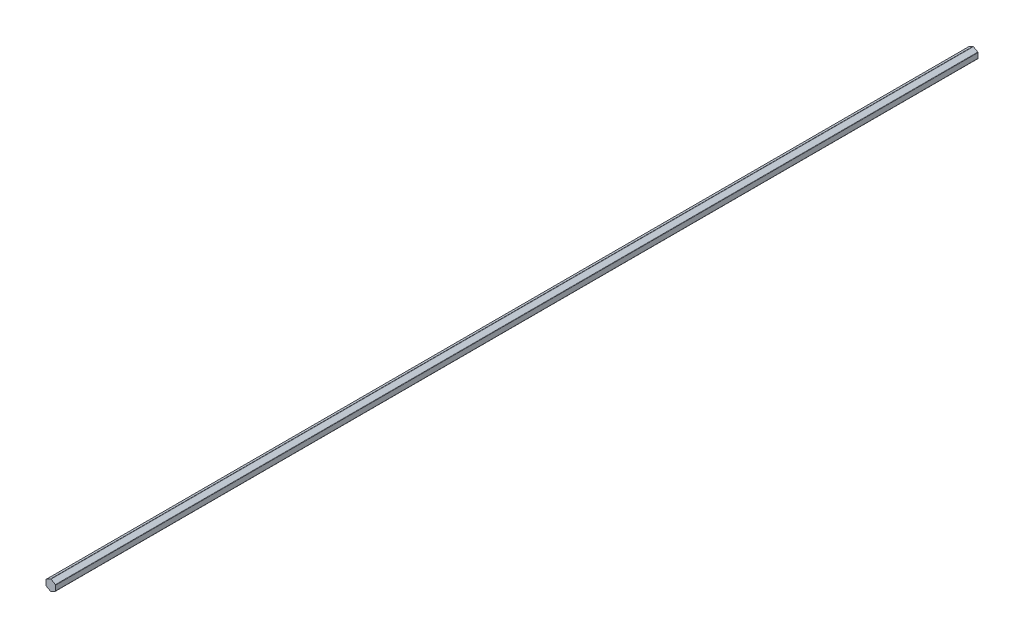
ISO-10303-21;
HEADER;
FILE_DESCRIPTION(('STEP AP214'),'2;1');
FILE_NAME('part.step','',(''),(''),'','','');
FILE_SCHEMA(('AUTOMOTIVE_DESIGN { 1 0 10303 214 1 1 1 1 }'));
ENDSEC;
DATA;
#1=APPLICATION_CONTEXT('core data for automotive mechanical design processes');
#2=APPLICATION_PROTOCOL_DEFINITION('international standard','automotive_design',2000,#1);
#3=PRODUCT_CONTEXT('',#1,'mechanical');
#4=PRODUCT('Part','Part','',(#3));
#5=PRODUCT_RELATED_PRODUCT_CATEGORY('part','',(#4));
#6=PRODUCT_DEFINITION_FORMATION('','',#4);
#7=PRODUCT_DEFINITION_CONTEXT('part definition',#1,'design');
#8=PRODUCT_DEFINITION('design','',#6,#7);
#9=PRODUCT_DEFINITION_SHAPE('','',#8);
#10=(LENGTH_UNIT() NAMED_UNIT(*) SI_UNIT(.MILLI.,.METRE.));
#11=(NAMED_UNIT(*) PLANE_ANGLE_UNIT() SI_UNIT($,.RADIAN.));
#12=(NAMED_UNIT(*) SI_UNIT($,.STERADIAN.) SOLID_ANGLE_UNIT());
#13=UNCERTAINTY_MEASURE_WITH_UNIT(LENGTH_MEASURE(1.E-05),#10,'distance_accuracy_value','');
#14=(GEOMETRIC_REPRESENTATION_CONTEXT(3) GLOBAL_UNCERTAINTY_ASSIGNED_CONTEXT((#13)) GLOBAL_UNIT_ASSIGNED_CONTEXT((#10,
#11,#12)) REPRESENTATION_CONTEXT('',''));
#15=CARTESIAN_POINT('',(0.,0.,0.));
#16=DIRECTION('',(0.,0.,1.));
#17=DIRECTION('',(1.,0.,0.));
#18=AXIS2_PLACEMENT_3D('',#15,#16,#17);
#19=CARTESIAN_POINT('',(4.7625,2.74963065701559,914.4));
#20=DIRECTION('',(-0.5,-0.866025403784439,0.));
#21=DIRECTION('',(0.866025403784439,-0.5,0.));
#22=AXIS2_PLACEMENT_3D('',#19,#20,#21);
#23=PLANE('',#22);
#24=DIRECTION('',(-0.866025403784439,0.5,0.));
#25=VECTOR('',#24,1.);
#26=CARTESIAN_POINT('',(4.7625,2.74963065701559,0.));
#27=LINE('',#26,#25);
#28=CARTESIAN_POINT('',(4.5085,2.89627762538976,0.));
#29=VERTEX_POINT('',#28);
#30=CARTESIAN_POINT('',(0.253999999999998,5.35261434565702,0.));
#31=VERTEX_POINT('',#30);
#32=EDGE_CURVE('E262',#29,#31,#27,.T.);
#33=ORIENTED_EDGE('',*,*,#32,.T.);
#34=DIRECTION('',(0.,0.,-1.));
#35=VECTOR('',#34,1.);
#36=CARTESIAN_POINT('',(0.253999999999997,5.35261434565702,914.4));
#37=LINE('',#36,#35);
#38=CARTESIAN_POINT('',(0.253999999999998,5.35261434565702,914.4));
#39=VERTEX_POINT('',#38);
#40=EDGE_CURVE('E11',#31,#39,#37,.F.);
#41=ORIENTED_EDGE('',*,*,#40,.T.);
#42=DIRECTION('',(-0.866025403784439,0.5,0.));
#43=VECTOR('',#42,1.);
#44=CARTESIAN_POINT('',(4.7625,2.74963065701559,914.4));
#45=LINE('',#44,#43);
#46=CARTESIAN_POINT('',(4.5085,2.89627762538976,914.4));
#47=VERTEX_POINT('',#46);
#48=EDGE_CURVE('E197',#47,#39,#45,.T.);
#49=ORIENTED_EDGE('',*,*,#48,.F.);
#50=DIRECTION('',(0.,0.,-1.));
#51=VECTOR('',#50,1.);
#52=CARTESIAN_POINT('',(4.5085,2.89627762538976,914.4));
#53=LINE('',#52,#51);
#54=EDGE_CURVE('E47',#47,#29,#53,.T.);
#55=ORIENTED_EDGE('',*,*,#54,.T.);
#56=EDGE_LOOP('',(#33,#41,#49,#55));
#57=FACE_BOUND('',#56,.T.);
#58=ADVANCED_FACE('F38',(#57),#23,.F.);
#59=CARTESIAN_POINT('',(0.,5.49926131403119,914.4));
#60=DIRECTION('',(0.5,-0.866025403784439,0.));
#61=DIRECTION('',(0.866025403784439,0.5,0.));
#62=AXIS2_PLACEMENT_3D('',#59,#60,#61);
#63=PLANE('',#62);
#64=DIRECTION('',(-0.866025403784439,-0.5,0.));
#65=VECTOR('',#64,1.);
#66=CARTESIAN_POINT('',(0.,5.49926131403119,0.));
#67=LINE('',#66,#65);
#68=CARTESIAN_POINT('',(-0.254000000000002,5.35261434565702,0.));
#69=VERTEX_POINT('',#68);
#70=CARTESIAN_POINT('',(-4.5085,2.89627762538976,0.));
#71=VERTEX_POINT('',#70);
#72=EDGE_CURVE('E191',#69,#71,#67,.T.);
#73=ORIENTED_EDGE('',*,*,#72,.T.);
#74=DIRECTION('',(0.,0.,-1.));
#75=VECTOR('',#74,1.);
#76=CARTESIAN_POINT('',(-4.5085,2.89627762538976,914.4));
#77=LINE('',#76,#75);
#78=CARTESIAN_POINT('',(-4.5085,2.89627762538976,914.4));
#79=VERTEX_POINT('',#78);
#80=EDGE_CURVE('E253',#71,#79,#77,.F.);
#81=ORIENTED_EDGE('',*,*,#80,.T.);
#82=DIRECTION('',(-0.866025403784439,-0.5,0.));
#83=VECTOR('',#82,1.);
#84=CARTESIAN_POINT('',(0.,5.49926131403119,914.4));
#85=LINE('',#84,#83);
#86=CARTESIAN_POINT('',(-0.254000000000002,5.35261434565702,914.4));
#87=VERTEX_POINT('',#86);
#88=EDGE_CURVE('E284',#87,#79,#85,.T.);
#89=ORIENTED_EDGE('',*,*,#88,.F.);
#90=DIRECTION('',(0.,0.,-1.));
#91=VECTOR('',#90,1.);
#92=CARTESIAN_POINT('',(-0.254000000000002,5.35261434565702,914.4));
#93=LINE('',#92,#91);
#94=EDGE_CURVE('E249',#87,#69,#93,.T.);
#95=ORIENTED_EDGE('',*,*,#94,.T.);
#96=EDGE_LOOP('',(#73,#81,#89,#95));
#97=FACE_BOUND('',#96,.T.);
#98=ADVANCED_FACE('F296',(#97),#63,.F.);
#99=CARTESIAN_POINT('',(-4.7625,2.74963065701559,914.4));
#100=DIRECTION('',(1.,0.,0.));
#101=DIRECTION('',(0.,0.,-1.));
#102=AXIS2_PLACEMENT_3D('',#99,#100,#101);
#103=PLANE('',#102);
#104=DIRECTION('',(0.,-1.,0.));
#105=VECTOR('',#104,1.);
#106=CARTESIAN_POINT('',(-4.7625,2.74963065701559,0.));
#107=LINE('',#106,#105);
#108=CARTESIAN_POINT('',(-4.7625,2.45633672026726,0.));
#109=VERTEX_POINT('',#108);
#110=CARTESIAN_POINT('',(-4.7625,-2.45633672026726,0.));
#111=VERTEX_POINT('',#110);
#112=EDGE_CURVE('E183',#109,#111,#107,.T.);
#113=ORIENTED_EDGE('',*,*,#112,.T.);
#114=DIRECTION('',(0.,0.,-1.));
#115=VECTOR('',#114,1.);
#116=CARTESIAN_POINT('',(-4.7625,-2.45633672026726,914.4));
#117=LINE('',#116,#115);
#118=CARTESIAN_POINT('',(-4.7625,-2.45633672026726,914.4));
#119=VERTEX_POINT('',#118);
#120=EDGE_CURVE('E158',#111,#119,#117,.F.);
#121=ORIENTED_EDGE('',*,*,#120,.T.);
#122=DIRECTION('',(0.,-1.,0.));
#123=VECTOR('',#122,1.);
#124=CARTESIAN_POINT('',(-4.7625,2.74963065701559,914.4));
#125=LINE('',#124,#123);
#126=CARTESIAN_POINT('',(-4.7625,2.45633672026726,914.4));
#127=VERTEX_POINT('',#126);
#128=EDGE_CURVE('E280',#127,#119,#125,.T.);
#129=ORIENTED_EDGE('',*,*,#128,.F.);
#130=DIRECTION('',(0.,0.,-1.));
#131=VECTOR('',#130,1.);
#132=CARTESIAN_POINT('',(-4.7625,2.45633672026726,914.4));
#133=LINE('',#132,#131);
#134=EDGE_CURVE('E164',#127,#109,#133,.T.);
#135=ORIENTED_EDGE('',*,*,#134,.T.);
#136=EDGE_LOOP('',(#113,#121,#129,#135));
#137=FACE_BOUND('',#136,.T.);
#138=ADVANCED_FACE('F304',(#137),#103,.F.);
#139=CARTESIAN_POINT('',(-4.7625,-2.74963065701559,914.4));
#140=DIRECTION('',(0.5,0.866025403784439,0.));
#141=DIRECTION('',(-0.866025403784439,0.5,0.));
#142=AXIS2_PLACEMENT_3D('',#139,#140,#141);
#143=PLANE('',#142);
#144=DIRECTION('',(0.866025403784439,-0.5,0.));
#145=VECTOR('',#144,1.);
#146=CARTESIAN_POINT('',(-4.7625,-2.74963065701559,914.4));
#147=LINE('',#146,#145);
#148=CARTESIAN_POINT('',(-4.5085,-2.89627762538976,914.4));
#149=VERTEX_POINT('',#148);
#150=CARTESIAN_POINT('',(-0.254,-5.35261434565702,914.4));
#151=VERTEX_POINT('',#150);
#152=EDGE_CURVE('E174',#149,#151,#147,.T.);
#153=ORIENTED_EDGE('',*,*,#152,.F.);
#154=DIRECTION('',(0.,0.,-1.));
#155=VECTOR('',#154,1.);
#156=CARTESIAN_POINT('',(-4.5085,-2.89627762538976,914.4));
#157=LINE('',#156,#155);
#158=CARTESIAN_POINT('',(-4.5085,-2.89627762538976,0.));
#159=VERTEX_POINT('',#158);
#160=EDGE_CURVE('E157',#149,#159,#157,.T.);
#161=ORIENTED_EDGE('',*,*,#160,.T.);
#162=DIRECTION('',(0.866025403784439,-0.5,0.));
#163=VECTOR('',#162,1.);
#164=CARTESIAN_POINT('',(-4.7625,-2.74963065701559,0.));
#165=LINE('',#164,#163);
#166=CARTESIAN_POINT('',(-0.254,-5.35261434565702,0.));
#167=VERTEX_POINT('',#166);
#168=EDGE_CURVE('E171',#159,#167,#165,.T.);
#169=ORIENTED_EDGE('',*,*,#168,.T.);
#170=DIRECTION('',(0.,0.,-1.));
#171=VECTOR('',#170,1.);
#172=CARTESIAN_POINT('',(-0.254000000000002,-5.35261434565702,914.4));
#173=LINE('',#172,#171);
#174=EDGE_CURVE('E177',#167,#151,#173,.F.);
#175=ORIENTED_EDGE('',*,*,#174,.T.);
#176=EDGE_LOOP('',(#153,#161,#169,#175));
#177=FACE_BOUND('',#176,.T.);
#178=ADVANCED_FACE('F170',(#177),#143,.F.);
#179=CARTESIAN_POINT('',(0.,-5.49926131403119,914.4));
#180=DIRECTION('',(-0.5,0.866025403784439,0.));
#181=DIRECTION('',(-0.866025403784439,-0.5,0.));
#182=AXIS2_PLACEMENT_3D('',#179,#180,#181);
#183=PLANE('',#182);
#184=DIRECTION('',(0.866025403784439,0.5,0.));
#185=VECTOR('',#184,1.);
#186=CARTESIAN_POINT('',(0.,-5.49926131403119,914.4));
#187=LINE('',#186,#185);
#188=CARTESIAN_POINT('',(0.253999999999999,-5.35261434565702,914.4));
#189=VERTEX_POINT('',#188);
#190=CARTESIAN_POINT('',(4.5085,-2.89627762538976,914.4));
#191=VERTEX_POINT('',#190);
#192=EDGE_CURVE('E275',#189,#191,#187,.T.);
#193=ORIENTED_EDGE('',*,*,#192,.F.);
#194=DIRECTION('',(0.,0.,-1.));
#195=VECTOR('',#194,1.);
#196=CARTESIAN_POINT('',(0.253999999999999,-5.35261434565702,914.4));
#197=LINE('',#196,#195);
#198=CARTESIAN_POINT('',(0.253999999999999,-5.35261434565702,0.));
#199=VERTEX_POINT('',#198);
#200=EDGE_CURVE('E239',#189,#199,#197,.T.);
#201=ORIENTED_EDGE('',*,*,#200,.T.);
#202=DIRECTION('',(0.866025403784439,0.5,0.));
#203=VECTOR('',#202,1.);
#204=CARTESIAN_POINT('',(0.,-5.49926131403119,0.));
#205=LINE('',#204,#203);
#206=CARTESIAN_POINT('',(4.5085,-2.89627762538976,0.));
#207=VERTEX_POINT('',#206);
#208=EDGE_CURVE('E182',#199,#207,#205,.T.);
#209=ORIENTED_EDGE('',*,*,#208,.T.);
#210=DIRECTION('',(0.,0.,-1.));
#211=VECTOR('',#210,1.);
#212=CARTESIAN_POINT('',(4.5085,-2.89627762538976,914.4));
#213=LINE('',#212,#211);
#214=EDGE_CURVE('E236',#207,#191,#213,.F.);
#215=ORIENTED_EDGE('',*,*,#214,.T.);
#216=EDGE_LOOP('',(#193,#201,#209,#215));
#217=FACE_BOUND('',#216,.T.);
#218=ADVANCED_FACE('F311',(#217),#183,.F.);
#219=CARTESIAN_POINT('',(4.7625,-2.7496306570156,914.4));
#220=DIRECTION('',(-1.,0.,0.));
#221=DIRECTION('',(0.,-1.,0.));
#222=AXIS2_PLACEMENT_3D('',#219,#220,#221);
#223=PLANE('',#222);
#224=DIRECTION('',(0.,1.,0.));
#225=VECTOR('',#224,1.);
#226=CARTESIAN_POINT('',(4.7625,-2.7496306570156,914.4));
#227=LINE('',#226,#225);
#228=CARTESIAN_POINT('',(4.7625,-2.45633672026727,914.4));
#229=VERTEX_POINT('',#228);
#230=CARTESIAN_POINT('',(4.7625,2.45633672026726,914.4));
#231=VERTEX_POINT('',#230);
#232=EDGE_CURVE('E199',#229,#231,#227,.T.);
#233=ORIENTED_EDGE('',*,*,#232,.F.);
#234=DIRECTION('',(0.,0.,-1.));
#235=VECTOR('',#234,1.);
#236=CARTESIAN_POINT('',(4.7625,-2.45633672026727,914.4));
#237=LINE('',#236,#235);
#238=CARTESIAN_POINT('',(4.7625,-2.45633672026727,0.));
#239=VERTEX_POINT('',#238);
#240=EDGE_CURVE('E245',#229,#239,#237,.T.);
#241=ORIENTED_EDGE('',*,*,#240,.T.);
#242=DIRECTION('',(0.,1.,0.));
#243=VECTOR('',#242,1.);
#244=CARTESIAN_POINT('',(4.7625,-2.7496306570156,0.));
#245=LINE('',#244,#243);
#246=CARTESIAN_POINT('',(4.7625,2.45633672026726,0.));
#247=VERTEX_POINT('',#246);
#248=EDGE_CURVE('E188',#239,#247,#245,.T.);
#249=ORIENTED_EDGE('',*,*,#248,.T.);
#250=DIRECTION('',(0.,0.,-1.));
#251=VECTOR('',#250,1.);
#252=CARTESIAN_POINT('',(4.7625,2.45633672026726,914.4));
#253=LINE('',#252,#251);
#254=EDGE_CURVE('E57',#247,#231,#253,.F.);
#255=ORIENTED_EDGE('',*,*,#254,.T.);
#256=EDGE_LOOP('',(#233,#241,#249,#255));
#257=FACE_BOUND('',#256,.T.);
#258=ADVANCED_FACE('F316',(#257),#223,.F.);
#259=CARTESIAN_POINT('',(0.,0.,914.4));
#260=DIRECTION('',(0.,0.,1.));
#261=DIRECTION('',(1.,0.,0.));
#262=AXIS2_PLACEMENT_3D('',#259,#260,#261);
#263=PLANE('',#262);
#264=ORIENTED_EDGE('',*,*,#128,.T.);
#265=CARTESIAN_POINT('',(-4.2545,-2.45633672026726,914.4));
#266=DIRECTION('',(0.,0.,1.));
#267=DIRECTION('',(1.,0.,0.));
#268=AXIS2_PLACEMENT_3D('',#265,#266,#267);
#269=CIRCLE('',#268,0.508);
#270=EDGE_CURVE('E233',#119,#149,#269,.T.);
#271=ORIENTED_EDGE('',*,*,#270,.T.);
#272=ORIENTED_EDGE('',*,*,#152,.T.);
#273=CARTESIAN_POINT('',(0.,-4.91267344053453,914.4));
#274=DIRECTION('',(0.,0.,1.));
#275=DIRECTION('',(1.,0.,0.));
#276=AXIS2_PLACEMENT_3D('',#273,#274,#275);
#277=CIRCLE('',#276,0.508);
#278=EDGE_CURVE('E230',#151,#189,#277,.T.);
#279=ORIENTED_EDGE('',*,*,#278,.T.);
#280=ORIENTED_EDGE('',*,*,#192,.T.);
#281=CARTESIAN_POINT('',(4.2545,-2.45633672026727,914.4));
#282=DIRECTION('',(0.,0.,1.));
#283=DIRECTION('',(1.,0.,0.));
#284=AXIS2_PLACEMENT_3D('',#281,#282,#283);
#285=CIRCLE('',#284,0.508);
#286=EDGE_CURVE('E66',#191,#229,#285,.T.);
#287=ORIENTED_EDGE('',*,*,#286,.T.);
#288=ORIENTED_EDGE('',*,*,#232,.T.);
#289=CARTESIAN_POINT('',(4.2545,2.45633672026726,914.4));
#290=DIRECTION('',(0.,0.,1.));
#291=DIRECTION('',(1.,0.,0.));
#292=AXIS2_PLACEMENT_3D('',#289,#290,#291);
#293=CIRCLE('',#292,0.508);
#294=EDGE_CURVE('E219',#231,#47,#293,.T.);
#295=ORIENTED_EDGE('',*,*,#294,.T.);
#296=ORIENTED_EDGE('',*,*,#48,.T.);
#297=CARTESIAN_POINT('',(0.,4.91267344053453,914.4));
#298=DIRECTION('',(0.,0.,1.));
#299=DIRECTION('',(1.,0.,0.));
#300=AXIS2_PLACEMENT_3D('',#297,#298,#299);
#301=CIRCLE('',#300,0.508);
#302=EDGE_CURVE('E222',#39,#87,#301,.T.);
#303=ORIENTED_EDGE('',*,*,#302,.T.);
#304=ORIENTED_EDGE('',*,*,#88,.T.);
#305=CARTESIAN_POINT('',(-4.2545,2.45633672026726,914.4));
#306=DIRECTION('',(0.,0.,1.));
#307=DIRECTION('',(1.,0.,0.));
#308=AXIS2_PLACEMENT_3D('',#305,#306,#307);
#309=CIRCLE('',#308,0.508);
#310=EDGE_CURVE('E225',#79,#127,#309,.T.);
#311=ORIENTED_EDGE('',*,*,#310,.T.);
#312=EDGE_LOOP('',(#264,#271,#272,#279,#280,#287,#288,#295,#296,#303,#304,#311));
#313=FACE_BOUND('',#312,.T.);
#314=ADVANCED_FACE('F290',(#313),#263,.T.);
#315=CARTESIAN_POINT('',(0.,0.,0.));
#316=DIRECTION('',(0.,0.,1.));
#317=DIRECTION('',(1.,0.,0.));
#318=AXIS2_PLACEMENT_3D('',#315,#316,#317);
#319=PLANE('',#318);
#320=ORIENTED_EDGE('',*,*,#168,.F.);
#321=CARTESIAN_POINT('',(-4.2545,-2.45633672026726,0.));
#322=DIRECTION('',(0.,0.,1.));
#323=DIRECTION('',(1.,0.,0.));
#324=AXIS2_PLACEMENT_3D('',#321,#322,#323);
#325=CIRCLE('',#324,0.508);
#326=EDGE_CURVE('E153',#159,#111,#325,.F.);
#327=ORIENTED_EDGE('',*,*,#326,.T.);
#328=ORIENTED_EDGE('',*,*,#112,.F.);
#329=CARTESIAN_POINT('',(-4.2545,2.45633672026726,0.));
#330=DIRECTION('',(0.,0.,1.));
#331=DIRECTION('',(1.,0.,0.));
#332=AXIS2_PLACEMENT_3D('',#329,#330,#331);
#333=CIRCLE('',#332,0.508);
#334=EDGE_CURVE('E206',#109,#71,#333,.F.);
#335=ORIENTED_EDGE('',*,*,#334,.T.);
#336=ORIENTED_EDGE('',*,*,#72,.F.);
#337=CARTESIAN_POINT('',(0.,4.91267344053453,0.));
#338=DIRECTION('',(0.,0.,1.));
#339=DIRECTION('',(1.,0.,0.));
#340=AXIS2_PLACEMENT_3D('',#337,#338,#339);
#341=CIRCLE('',#340,0.508);
#342=EDGE_CURVE('E203',#69,#31,#341,.F.);
#343=ORIENTED_EDGE('',*,*,#342,.T.);
#344=ORIENTED_EDGE('',*,*,#32,.F.);
#345=CARTESIAN_POINT('',(4.2545,2.45633672026726,0.));
#346=DIRECTION('',(0.,0.,1.));
#347=DIRECTION('',(1.,0.,0.));
#348=AXIS2_PLACEMENT_3D('',#345,#346,#347);
#349=CIRCLE('',#348,0.508);
#350=EDGE_CURVE('E176',#29,#247,#349,.F.);
#351=ORIENTED_EDGE('',*,*,#350,.T.);
#352=ORIENTED_EDGE('',*,*,#248,.F.);
#353=CARTESIAN_POINT('',(4.2545,-2.45633672026727,0.));
#354=DIRECTION('',(0.,0.,1.));
#355=DIRECTION('',(1.,0.,0.));
#356=AXIS2_PLACEMENT_3D('',#353,#354,#355);
#357=CIRCLE('',#356,0.508);
#358=EDGE_CURVE('E209',#239,#207,#357,.F.);
#359=ORIENTED_EDGE('',*,*,#358,.T.);
#360=ORIENTED_EDGE('',*,*,#208,.F.);
#361=CARTESIAN_POINT('',(0.,-4.91267344053453,0.));
#362=DIRECTION('',(0.,0.,1.));
#363=DIRECTION('',(1.,0.,0.));
#364=AXIS2_PLACEMENT_3D('',#361,#362,#363);
#365=CIRCLE('',#364,0.508);
#366=EDGE_CURVE('E165',#199,#167,#365,.F.);
#367=ORIENTED_EDGE('',*,*,#366,.T.);
#368=EDGE_LOOP('',(#320,#327,#328,#335,#336,#343,#344,#351,#352,#359,#360,#367));
#369=FACE_BOUND('',#368,.T.);
#370=ADVANCED_FACE('F179',(#369),#319,.F.);
#371=CARTESIAN_POINT('',(-4.2545,-2.45633672026726,914.4));
#372=DIRECTION('',(0.,0.,-1.));
#373=DIRECTION('',(-1.,0.,0.));
#374=AXIS2_PLACEMENT_3D('',#371,#372,#373);
#375=CYLINDRICAL_SURFACE('',#374,0.508);
#376=ORIENTED_EDGE('',*,*,#270,.F.);
#377=ORIENTED_EDGE('',*,*,#120,.F.);
#378=ORIENTED_EDGE('',*,*,#326,.F.);
#379=ORIENTED_EDGE('',*,*,#160,.F.);
#380=EDGE_LOOP('',(#376,#377,#378,#379));
#381=FACE_BOUND('',#380,.T.);
#382=ADVANCED_FACE('F156',(#381),#375,.T.);
#383=CARTESIAN_POINT('',(0.,-4.91267344053453,914.4));
#384=DIRECTION('',(0.,0.,-1.));
#385=DIRECTION('',(-1.,0.,0.));
#386=AXIS2_PLACEMENT_3D('',#383,#384,#385);
#387=CYLINDRICAL_SURFACE('',#386,0.508);
#388=ORIENTED_EDGE('',*,*,#278,.F.);
#389=ORIENTED_EDGE('',*,*,#174,.F.);
#390=ORIENTED_EDGE('',*,*,#366,.F.);
#391=ORIENTED_EDGE('',*,*,#200,.F.);
#392=EDGE_LOOP('',(#388,#389,#390,#391));
#393=FACE_BOUND('',#392,.T.);
#394=ADVANCED_FACE('F309',(#393),#387,.T.);
#395=CARTESIAN_POINT('',(4.2545,-2.45633672026727,914.4));
#396=DIRECTION('',(0.,0.,-1.));
#397=DIRECTION('',(-1.,0.,0.));
#398=AXIS2_PLACEMENT_3D('',#395,#396,#397);
#399=CYLINDRICAL_SURFACE('',#398,0.508);
#400=ORIENTED_EDGE('',*,*,#286,.F.);
#401=ORIENTED_EDGE('',*,*,#214,.F.);
#402=ORIENTED_EDGE('',*,*,#358,.F.);
#403=ORIENTED_EDGE('',*,*,#240,.F.);
#404=EDGE_LOOP('',(#400,#401,#402,#403));
#405=FACE_BOUND('',#404,.T.);
#406=ADVANCED_FACE('F315',(#405),#399,.T.);
#407=CARTESIAN_POINT('',(-4.2545,2.45633672026726,914.4));
#408=DIRECTION('',(0.,0.,-1.));
#409=DIRECTION('',(-1.,0.,0.));
#410=AXIS2_PLACEMENT_3D('',#407,#408,#409);
#411=CYLINDRICAL_SURFACE('',#410,0.508);
#412=ORIENTED_EDGE('',*,*,#310,.F.);
#413=ORIENTED_EDGE('',*,*,#80,.F.);
#414=ORIENTED_EDGE('',*,*,#334,.F.);
#415=ORIENTED_EDGE('',*,*,#134,.F.);
#416=EDGE_LOOP('',(#412,#413,#414,#415));
#417=FACE_BOUND('',#416,.T.);
#418=ADVANCED_FACE('F301',(#417),#411,.T.);
#419=CARTESIAN_POINT('',(0.,4.91267344053453,914.4));
#420=DIRECTION('',(0.,0.,-1.));
#421=DIRECTION('',(-1.,0.,0.));
#422=AXIS2_PLACEMENT_3D('',#419,#420,#421);
#423=CYLINDRICAL_SURFACE('',#422,0.508);
#424=ORIENTED_EDGE('',*,*,#302,.F.);
#425=ORIENTED_EDGE('',*,*,#40,.F.);
#426=ORIENTED_EDGE('',*,*,#342,.F.);
#427=ORIENTED_EDGE('',*,*,#94,.F.);
#428=EDGE_LOOP('',(#424,#425,#426,#427));
#429=FACE_BOUND('',#428,.T.);
#430=ADVANCED_FACE('F294',(#429),#423,.T.);
#431=CARTESIAN_POINT('',(4.2545,2.45633672026726,914.4));
#432=DIRECTION('',(0.,0.,-1.));
#433=DIRECTION('',(-1.,0.,0.));
#434=AXIS2_PLACEMENT_3D('',#431,#432,#433);
#435=CYLINDRICAL_SURFACE('',#434,0.508);
#436=ORIENTED_EDGE('',*,*,#294,.F.);
#437=ORIENTED_EDGE('',*,*,#254,.F.);
#438=ORIENTED_EDGE('',*,*,#350,.F.);
#439=ORIENTED_EDGE('',*,*,#54,.F.);
#440=EDGE_LOOP('',(#436,#437,#438,#439));
#441=FACE_BOUND('',#440,.T.);
#442=ADVANCED_FACE('F40',(#441),#435,.T.);
#443=CLOSED_SHELL('',(#58,#98,#138,#178,#218,#258,#314,#370,#382,#394,#406,#418,#430,#442));
#444=MANIFOLD_SOLID_BREP('B2',#443);
#445=ADVANCED_BREP_SHAPE_REPRESENTATION('',(#18,#444),#14);
#446=SHAPE_DEFINITION_REPRESENTATION(#9,#445);
ENDSEC;
END-ISO-10303-21;
